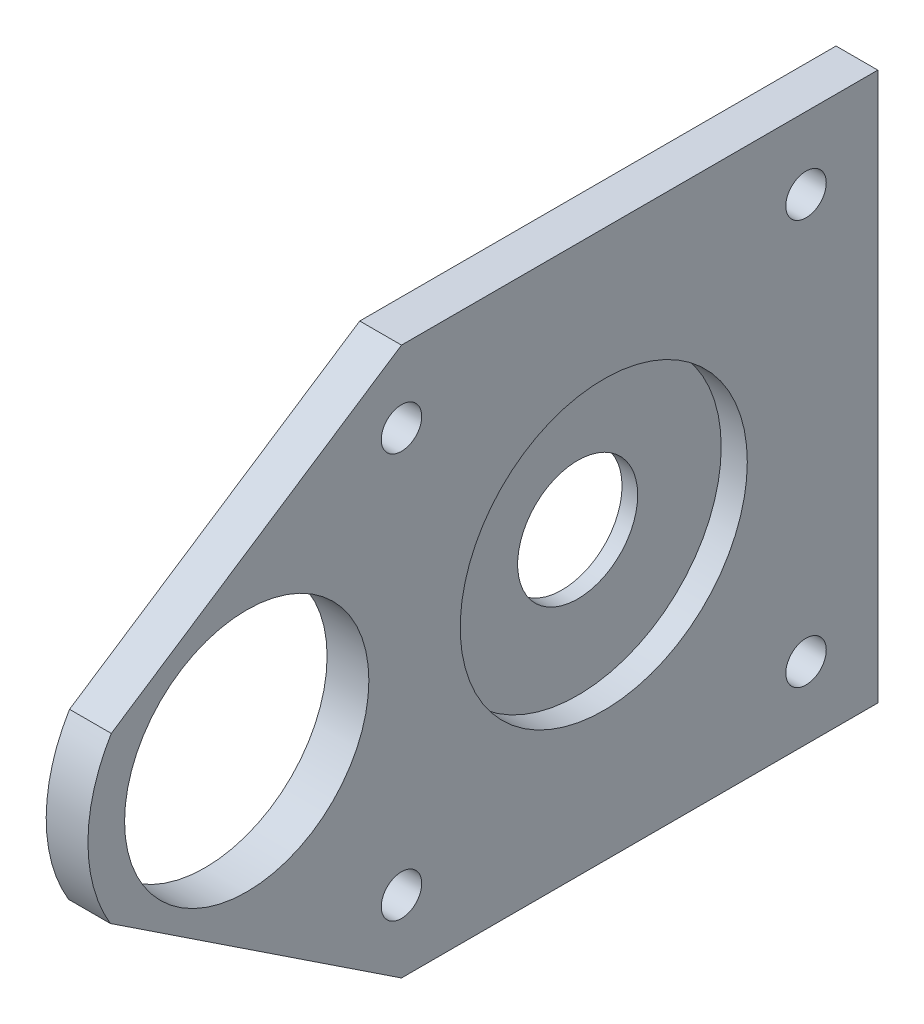
ISO-10303-21;
HEADER;
FILE_DESCRIPTION(('STEP AP214'),'2;1');
FILE_NAME('part.step','',(''),(''),'','','');
FILE_SCHEMA(('AUTOMOTIVE_DESIGN { 1 0 10303 214 1 1 1 1 }'));
ENDSEC;
DATA;
#1=APPLICATION_CONTEXT('core data for automotive mechanical design processes');
#2=APPLICATION_PROTOCOL_DEFINITION('international standard','automotive_design',2000,#1);
#3=PRODUCT_CONTEXT('',#1,'mechanical');
#4=PRODUCT('Part','Part','',(#3));
#5=PRODUCT_RELATED_PRODUCT_CATEGORY('part','',(#4));
#6=PRODUCT_DEFINITION_FORMATION('','',#4);
#7=PRODUCT_DEFINITION_CONTEXT('part definition',#1,'design');
#8=PRODUCT_DEFINITION('design','',#6,#7);
#9=PRODUCT_DEFINITION_SHAPE('','',#8);
#10=(LENGTH_UNIT() NAMED_UNIT(*) SI_UNIT(.MILLI.,.METRE.));
#11=(NAMED_UNIT(*) PLANE_ANGLE_UNIT() SI_UNIT($,.RADIAN.));
#12=(NAMED_UNIT(*) SI_UNIT($,.STERADIAN.) SOLID_ANGLE_UNIT());
#13=UNCERTAINTY_MEASURE_WITH_UNIT(LENGTH_MEASURE(1.E-05),#10,'distance_accuracy_value','');
#14=(GEOMETRIC_REPRESENTATION_CONTEXT(3) GLOBAL_UNCERTAINTY_ASSIGNED_CONTEXT((#13)) GLOBAL_UNIT_ASSIGNED_CONTEXT((#10,
#11,#12)) REPRESENTATION_CONTEXT('',''));
#15=CARTESIAN_POINT('',(0.,0.,0.));
#16=DIRECTION('',(0.,0.,1.));
#17=DIRECTION('',(1.,0.,0.));
#18=AXIS2_PLACEMENT_3D('',#15,#16,#17);
#19=CARTESIAN_POINT('',(-1.6,0.,21.));
#20=DIRECTION('',(1.,0.,0.));
#21=DIRECTION('',(0.,0.,-1.));
#22=AXIS2_PLACEMENT_3D('',#19,#20,#21);
#23=CYLINDRICAL_SURFACE('',#22,4.6);
#24=CARTESIAN_POINT('',(-1.6,0.,21.));
#25=DIRECTION('',(1.,0.,0.));
#26=DIRECTION('',(0.,0.,-1.));
#27=AXIS2_PLACEMENT_3D('',#24,#25,#26);
#28=CIRCLE('',#27,4.6);
#29=CARTESIAN_POINT('',(-1.6,0.,16.4));
#30=VERTEX_POINT('',#29);
#31=EDGE_CURVE('E105',#30,#30,#28,.T.);
#32=ORIENTED_EDGE('',*,*,#31,.F.);
#33=EDGE_LOOP('',(#32));
#34=FACE_BOUND('',#33,.T.);
#35=CARTESIAN_POINT('',(-0.4,0.,21.));
#36=DIRECTION('',(1.,0.,0.));
#37=DIRECTION('',(0.,0.,-1.));
#38=AXIS2_PLACEMENT_3D('',#35,#36,#37);
#39=CIRCLE('',#38,4.6);
#40=CARTESIAN_POINT('',(-0.4,0.,16.4));
#41=VERTEX_POINT('',#40);
#42=EDGE_CURVE('E33',#41,#41,#39,.F.);
#43=ORIENTED_EDGE('',*,*,#42,.F.);
#44=EDGE_LOOP('',(#43));
#45=FACE_BOUND('',#44,.T.);
#46=ADVANCED_FACE('F29',(#34,#45),#23,.F.);
#47=CARTESIAN_POINT('',(-1.6,21.,75.));
#48=DIRECTION('',(1.,0.,0.));
#49=DIRECTION('',(0.,1.,0.));
#50=AXIS2_PLACEMENT_3D('',#47,#48,#49);
#51=PLANE('',#50);
#52=ORIENTED_EDGE('',*,*,#31,.T.);
#53=EDGE_LOOP('',(#52));
#54=FACE_BOUND('',#53,.T.);
#55=CARTESIAN_POINT('',(-1.6,0.,48.36));
#56=DIRECTION('',(1.,0.,0.));
#57=DIRECTION('',(0.,0.,-1.));
#58=AXIS2_PLACEMENT_3D('',#55,#56,#57);
#59=CIRCLE('',#58,9.36);
#60=CARTESIAN_POINT('',(-1.6,0.,39.));
#61=VERTEX_POINT('',#60);
#62=EDGE_CURVE('E147',#61,#61,#59,.T.);
#63=ORIENTED_EDGE('',*,*,#62,.T.);
#64=EDGE_LOOP('',(#63));
#65=FACE_BOUND('',#64,.T.);
#66=CARTESIAN_POINT('',(-1.6,-15.5,36.5));
#67=DIRECTION('',(1.,0.,0.));
#68=DIRECTION('',(0.,0.,-1.));
#69=AXIS2_PLACEMENT_3D('',#66,#67,#68);
#70=CIRCLE('',#69,1.55);
#71=CARTESIAN_POINT('',(-1.6,-15.5,34.95));
#72=VERTEX_POINT('',#71);
#73=EDGE_CURVE('E141',#72,#72,#70,.T.);
#74=ORIENTED_EDGE('',*,*,#73,.T.);
#75=EDGE_LOOP('',(#74));
#76=FACE_BOUND('',#75,.T.);
#77=CARTESIAN_POINT('',(-1.6,15.5,36.5));
#78=DIRECTION('',(1.,0.,0.));
#79=DIRECTION('',(0.,0.,-1.));
#80=AXIS2_PLACEMENT_3D('',#77,#78,#79);
#81=CIRCLE('',#80,1.55);
#82=CARTESIAN_POINT('',(-1.6,15.5,34.95));
#83=VERTEX_POINT('',#82);
#84=EDGE_CURVE('E135',#83,#83,#81,.T.);
#85=ORIENTED_EDGE('',*,*,#84,.T.);
#86=EDGE_LOOP('',(#85));
#87=FACE_BOUND('',#86,.T.);
#88=CARTESIAN_POINT('',(-1.6,-15.5,5.5));
#89=DIRECTION('',(1.,0.,0.));
#90=DIRECTION('',(0.,0.,-1.));
#91=AXIS2_PLACEMENT_3D('',#88,#89,#90);
#92=CIRCLE('',#91,1.55);
#93=CARTESIAN_POINT('',(-1.6,-15.5,3.95));
#94=VERTEX_POINT('',#93);
#95=EDGE_CURVE('E129',#94,#94,#92,.T.);
#96=ORIENTED_EDGE('',*,*,#95,.T.);
#97=EDGE_LOOP('',(#96));
#98=FACE_BOUND('',#97,.T.);
#99=CARTESIAN_POINT('',(-1.6,15.5,5.5));
#100=DIRECTION('',(1.,0.,0.));
#101=DIRECTION('',(0.,0.,-1.));
#102=AXIS2_PLACEMENT_3D('',#99,#100,#101);
#103=CIRCLE('',#102,1.55);
#104=CARTESIAN_POINT('',(-1.6,15.5,3.95));
#105=VERTEX_POINT('',#104);
#106=EDGE_CURVE('E123',#105,#105,#103,.T.);
#107=ORIENTED_EDGE('',*,*,#106,.T.);
#108=EDGE_LOOP('',(#107));
#109=FACE_BOUND('',#108,.T.);
#110=CARTESIAN_POINT('',(-1.6,0.,48.36));
#111=DIRECTION('',(-1.,0.,0.));
#112=DIRECTION('',(0.,0.,-1.));
#113=AXIS2_PLACEMENT_3D('',#110,#111,#112);
#114=CIRCLE('',#113,12.1661417980393);
#115=CARTESIAN_POINT('',(-1.6,-6.22626959128413,58.8122042281354));
#116=VERTEX_POINT('',#115);
#117=CARTESIAN_POINT('',(-1.6,6.35,58.7375));
#118=VERTEX_POINT('',#117);
#119=EDGE_CURVE('E159',#116,#118,#114,.T.);
#120=ORIENTED_EDGE('',*,*,#119,.T.);
#121=DIRECTION('',(0.,0.550142289173026,-0.835070932115028));
#122=VECTOR('',#121,1.);
#123=CARTESIAN_POINT('',(-1.6,21.,36.5));
#124=LINE('',#123,#122);
#125=CARTESIAN_POINT('',(-1.6,21.,36.5));
#126=VERTEX_POINT('',#125);
#127=EDGE_CURVE('E95',#118,#126,#124,.T.);
#128=ORIENTED_EDGE('',*,*,#127,.T.);
#129=DIRECTION('',(0.,0.,-1.));
#130=VECTOR('',#129,1.);
#131=CARTESIAN_POINT('',(-1.6,21.,75.));
#132=LINE('',#131,#130);
#133=CARTESIAN_POINT('',(-1.6,21.,0.));
#134=VERTEX_POINT('',#133);
#135=EDGE_CURVE('E53',#126,#134,#132,.T.);
#136=ORIENTED_EDGE('',*,*,#135,.T.);
#137=DIRECTION('',(0.,-1.,0.));
#138=VECTOR('',#137,1.);
#139=CARTESIAN_POINT('',(-1.6,21.,0.));
#140=LINE('',#139,#138);
#141=CARTESIAN_POINT('',(-1.59999999999999,-21.,0.));
#142=VERTEX_POINT('',#141);
#143=EDGE_CURVE('E121',#134,#142,#140,.T.);
#144=ORIENTED_EDGE('',*,*,#143,.T.);
#145=DIRECTION('',(0.,0.,-1.));
#146=VECTOR('',#145,1.);
#147=CARTESIAN_POINT('',(-1.59999999999999,-21.,75.));
#148=LINE('',#147,#146);
#149=CARTESIAN_POINT('',(-1.6,-21.,36.5));
#150=VERTEX_POINT('',#149);
#151=EDGE_CURVE('E11',#150,#142,#148,.T.);
#152=ORIENTED_EDGE('',*,*,#151,.F.);
#153=DIRECTION('',(0.,0.552082613670704,0.833789414470179));
#154=VECTOR('',#153,1.);
#155=CARTESIAN_POINT('',(-1.6,-6.22626959128413,58.8122042281354));
#156=LINE('',#155,#154);
#157=EDGE_CURVE('E90',#150,#116,#156,.T.);
#158=ORIENTED_EDGE('',*,*,#157,.T.);
#159=EDGE_LOOP('',(#120,#128,#136,#144,#152,#158));
#160=FACE_BOUND('',#159,.T.);
#161=ADVANCED_FACE('F31',(#54,#65,#76,#87,#98,#109,#160),#51,.F.);
#162=CARTESIAN_POINT('',(-1.59999999999999,-21.,75.));
#163=DIRECTION('',(0.,1.,0.));
#164=DIRECTION('',(0.,0.,1.));
#165=AXIS2_PLACEMENT_3D('',#162,#163,#164);
#166=PLANE('',#165);
#167=DIRECTION('',(0.,0.,-1.));
#168=VECTOR('',#167,1.);
#169=CARTESIAN_POINT('',(1.6,-21.,75.));
#170=LINE('',#169,#168);
#171=CARTESIAN_POINT('',(1.6,-21.,36.5));
#172=VERTEX_POINT('',#171);
#173=CARTESIAN_POINT('',(1.6,-21.,0.));
#174=VERTEX_POINT('',#173);
#175=EDGE_CURVE('E38',#172,#174,#170,.T.);
#176=ORIENTED_EDGE('',*,*,#175,.F.);
#177=DIRECTION('',(1.,0.,0.));
#178=VECTOR('',#177,1.);
#179=CARTESIAN_POINT('',(-1.6,-21.,36.5));
#180=LINE('',#179,#178);
#181=EDGE_CURVE('E84',#150,#172,#180,.T.);
#182=ORIENTED_EDGE('',*,*,#181,.F.);
#183=ORIENTED_EDGE('',*,*,#151,.T.);
#184=DIRECTION('',(1.,0.,0.));
#185=VECTOR('',#184,1.);
#186=CARTESIAN_POINT('',(-1.59999999999999,-21.,0.));
#187=LINE('',#186,#185);
#188=EDGE_CURVE('E109',#142,#174,#187,.T.);
#189=ORIENTED_EDGE('',*,*,#188,.T.);
#190=EDGE_LOOP('',(#176,#182,#183,#189));
#191=FACE_BOUND('',#190,.T.);
#192=ADVANCED_FACE('F107',(#191),#166,.F.);
#193=CARTESIAN_POINT('',(1.6,21.,75.));
#194=DIRECTION('',(-1.,0.,0.));
#195=DIRECTION('',(0.,0.,1.));
#196=AXIS2_PLACEMENT_3D('',#193,#194,#195);
#197=PLANE('',#196);
#198=CARTESIAN_POINT('',(1.6,0.,21.));
#199=DIRECTION('',(1.,0.,0.));
#200=DIRECTION('',(0.,0.,-1.));
#201=AXIS2_PLACEMENT_3D('',#198,#199,#200);
#202=CIRCLE('',#201,11.);
#203=CARTESIAN_POINT('',(1.6,0.,10.));
#204=VERTEX_POINT('',#203);
#205=EDGE_CURVE('E170',#204,#204,#202,.T.);
#206=ORIENTED_EDGE('',*,*,#205,.F.);
#207=EDGE_LOOP('',(#206));
#208=FACE_BOUND('',#207,.T.);
#209=DIRECTION('',(0.,0.,-1.));
#210=VECTOR('',#209,1.);
#211=CARTESIAN_POINT('',(1.6,21.,75.));
#212=LINE('',#211,#210);
#213=CARTESIAN_POINT('',(1.6,21.,36.5));
#214=VERTEX_POINT('',#213);
#215=CARTESIAN_POINT('',(1.6,21.,0.));
#216=VERTEX_POINT('',#215);
#217=EDGE_CURVE('E111',#214,#216,#212,.T.);
#218=ORIENTED_EDGE('',*,*,#217,.F.);
#219=DIRECTION('',(0.,0.550142289173026,-0.835070932115028));
#220=VECTOR('',#219,1.);
#221=CARTESIAN_POINT('',(1.6,21.,36.5));
#222=LINE('',#221,#220);
#223=CARTESIAN_POINT('',(1.6,6.35,58.7375));
#224=VERTEX_POINT('',#223);
#225=EDGE_CURVE('E45',#224,#214,#222,.T.);
#226=ORIENTED_EDGE('',*,*,#225,.F.);
#227=CARTESIAN_POINT('',(1.6,0.,48.36));
#228=DIRECTION('',(-1.,0.,0.));
#229=DIRECTION('',(0.,0.,-1.));
#230=AXIS2_PLACEMENT_3D('',#227,#228,#229);
#231=CIRCLE('',#230,12.1661417980393);
#232=CARTESIAN_POINT('',(1.6,-6.22626959128413,58.8122042281354));
#233=VERTEX_POINT('',#232);
#234=EDGE_CURVE('E104',#233,#224,#231,.T.);
#235=ORIENTED_EDGE('',*,*,#234,.F.);
#236=DIRECTION('',(0.,0.552082613670704,0.833789414470179));
#237=VECTOR('',#236,1.);
#238=CARTESIAN_POINT('',(1.6,-6.22626959128413,58.8122042281354));
#239=LINE('',#238,#237);
#240=EDGE_CURVE('E87',#172,#233,#239,.T.);
#241=ORIENTED_EDGE('',*,*,#240,.F.);
#242=ORIENTED_EDGE('',*,*,#175,.T.);
#243=DIRECTION('',(0.,1.,0.));
#244=VECTOR('',#243,1.);
#245=CARTESIAN_POINT('',(1.6,21.,0.));
#246=LINE('',#245,#244);
#247=EDGE_CURVE('E118',#174,#216,#246,.T.);
#248=ORIENTED_EDGE('',*,*,#247,.T.);
#249=EDGE_LOOP('',(#218,#226,#235,#241,#242,#248));
#250=FACE_BOUND('',#249,.T.);
#251=CARTESIAN_POINT('',(1.6,0.,48.36));
#252=DIRECTION('',(1.,0.,0.));
#253=DIRECTION('',(0.,0.,-1.));
#254=AXIS2_PLACEMENT_3D('',#251,#252,#253);
#255=CIRCLE('',#254,9.36);
#256=CARTESIAN_POINT('',(1.6,0.,39.));
#257=VERTEX_POINT('',#256);
#258=EDGE_CURVE('E150',#257,#257,#255,.T.);
#259=ORIENTED_EDGE('',*,*,#258,.F.);
#260=EDGE_LOOP('',(#259));
#261=FACE_BOUND('',#260,.T.);
#262=CARTESIAN_POINT('',(1.6,-15.5,36.5));
#263=DIRECTION('',(1.,0.,0.));
#264=DIRECTION('',(0.,0.,-1.));
#265=AXIS2_PLACEMENT_3D('',#262,#263,#264);
#266=CIRCLE('',#265,1.55);
#267=CARTESIAN_POINT('',(1.6,-15.5,34.95));
#268=VERTEX_POINT('',#267);
#269=EDGE_CURVE('E144',#268,#268,#266,.T.);
#270=ORIENTED_EDGE('',*,*,#269,.F.);
#271=EDGE_LOOP('',(#270));
#272=FACE_BOUND('',#271,.T.);
#273=CARTESIAN_POINT('',(1.6,15.5,36.5));
#274=DIRECTION('',(1.,0.,0.));
#275=DIRECTION('',(0.,0.,-1.));
#276=AXIS2_PLACEMENT_3D('',#273,#274,#275);
#277=CIRCLE('',#276,1.55);
#278=CARTESIAN_POINT('',(1.6,15.5,34.95));
#279=VERTEX_POINT('',#278);
#280=EDGE_CURVE('E138',#279,#279,#277,.T.);
#281=ORIENTED_EDGE('',*,*,#280,.F.);
#282=EDGE_LOOP('',(#281));
#283=FACE_BOUND('',#282,.T.);
#284=CARTESIAN_POINT('',(1.6,-15.5,5.5));
#285=DIRECTION('',(1.,0.,0.));
#286=DIRECTION('',(0.,0.,-1.));
#287=AXIS2_PLACEMENT_3D('',#284,#285,#286);
#288=CIRCLE('',#287,1.55);
#289=CARTESIAN_POINT('',(1.6,-15.5,3.95));
#290=VERTEX_POINT('',#289);
#291=EDGE_CURVE('E132',#290,#290,#288,.T.);
#292=ORIENTED_EDGE('',*,*,#291,.F.);
#293=EDGE_LOOP('',(#292));
#294=FACE_BOUND('',#293,.T.);
#295=CARTESIAN_POINT('',(1.6,15.5,5.5));
#296=DIRECTION('',(1.,0.,0.));
#297=DIRECTION('',(0.,0.,-1.));
#298=AXIS2_PLACEMENT_3D('',#295,#296,#297);
#299=CIRCLE('',#298,1.55);
#300=CARTESIAN_POINT('',(1.6,15.5,3.95));
#301=VERTEX_POINT('',#300);
#302=EDGE_CURVE('E126',#301,#301,#299,.T.);
#303=ORIENTED_EDGE('',*,*,#302,.F.);
#304=EDGE_LOOP('',(#303));
#305=FACE_BOUND('',#304,.T.);
#306=ADVANCED_FACE('F99',(#208,#250,#261,#272,#283,#294,#305),#197,.F.);
#307=CARTESIAN_POINT('',(-1.6,21.,75.));
#308=DIRECTION('',(0.,-1.,0.));
#309=DIRECTION('',(0.,0.,-1.));
#310=AXIS2_PLACEMENT_3D('',#307,#308,#309);
#311=PLANE('',#310);
#312=ORIENTED_EDGE('',*,*,#135,.F.);
#313=DIRECTION('',(1.,0.,0.));
#314=VECTOR('',#313,1.);
#315=CARTESIAN_POINT('',(-1.6,21.,36.5));
#316=LINE('',#315,#314);
#317=EDGE_CURVE('E152',#126,#214,#316,.T.);
#318=ORIENTED_EDGE('',*,*,#317,.T.);
#319=ORIENTED_EDGE('',*,*,#217,.T.);
#320=DIRECTION('',(-1.,0.,0.));
#321=VECTOR('',#320,1.);
#322=CARTESIAN_POINT('',(-1.6,21.,0.));
#323=LINE('',#322,#321);
#324=EDGE_CURVE('E116',#216,#134,#323,.T.);
#325=ORIENTED_EDGE('',*,*,#324,.T.);
#326=EDGE_LOOP('',(#312,#318,#319,#325));
#327=FACE_BOUND('',#326,.T.);
#328=ADVANCED_FACE('F177',(#327),#311,.F.);
#329=CARTESIAN_POINT('',(-1.59999999999999,-21.,0.));
#330=DIRECTION('',(0.,0.,1.));
#331=DIRECTION('',(1.,0.,0.));
#332=AXIS2_PLACEMENT_3D('',#329,#330,#331);
#333=PLANE('',#332);
#334=ORIENTED_EDGE('',*,*,#143,.F.);
#335=ORIENTED_EDGE('',*,*,#324,.F.);
#336=ORIENTED_EDGE('',*,*,#247,.F.);
#337=ORIENTED_EDGE('',*,*,#188,.F.);
#338=EDGE_LOOP('',(#334,#335,#336,#337));
#339=FACE_BOUND('',#338,.T.);
#340=ADVANCED_FACE('F183',(#339),#333,.F.);
#341=CARTESIAN_POINT('',(-1.6,15.5,5.5));
#342=DIRECTION('',(1.,0.,0.));
#343=DIRECTION('',(0.,0.,-1.));
#344=AXIS2_PLACEMENT_3D('',#341,#342,#343);
#345=CYLINDRICAL_SURFACE('',#344,1.55);
#346=ORIENTED_EDGE('',*,*,#106,.F.);
#347=EDGE_LOOP('',(#346));
#348=FACE_BOUND('',#347,.T.);
#349=ORIENTED_EDGE('',*,*,#302,.T.);
#350=EDGE_LOOP('',(#349));
#351=FACE_BOUND('',#350,.T.);
#352=ADVANCED_FACE('F223',(#348,#351),#345,.F.);
#353=CARTESIAN_POINT('',(-1.6,-15.5,5.5));
#354=DIRECTION('',(1.,0.,0.));
#355=DIRECTION('',(0.,0.,-1.));
#356=AXIS2_PLACEMENT_3D('',#353,#354,#355);
#357=CYLINDRICAL_SURFACE('',#356,1.55);
#358=ORIENTED_EDGE('',*,*,#95,.F.);
#359=EDGE_LOOP('',(#358));
#360=FACE_BOUND('',#359,.T.);
#361=ORIENTED_EDGE('',*,*,#291,.T.);
#362=EDGE_LOOP('',(#361));
#363=FACE_BOUND('',#362,.T.);
#364=ADVANCED_FACE('F219',(#360,#363),#357,.F.);
#365=CARTESIAN_POINT('',(-1.6,15.5,36.5));
#366=DIRECTION('',(1.,0.,0.));
#367=DIRECTION('',(0.,0.,-1.));
#368=AXIS2_PLACEMENT_3D('',#365,#366,#367);
#369=CYLINDRICAL_SURFACE('',#368,1.55);
#370=ORIENTED_EDGE('',*,*,#84,.F.);
#371=EDGE_LOOP('',(#370));
#372=FACE_BOUND('',#371,.T.);
#373=ORIENTED_EDGE('',*,*,#280,.T.);
#374=EDGE_LOOP('',(#373));
#375=FACE_BOUND('',#374,.T.);
#376=ADVANCED_FACE('F215',(#372,#375),#369,.F.);
#377=CARTESIAN_POINT('',(-1.6,-15.5,36.5));
#378=DIRECTION('',(1.,0.,0.));
#379=DIRECTION('',(0.,0.,-1.));
#380=AXIS2_PLACEMENT_3D('',#377,#378,#379);
#381=CYLINDRICAL_SURFACE('',#380,1.55);
#382=ORIENTED_EDGE('',*,*,#73,.F.);
#383=EDGE_LOOP('',(#382));
#384=FACE_BOUND('',#383,.T.);
#385=ORIENTED_EDGE('',*,*,#269,.T.);
#386=EDGE_LOOP('',(#385));
#387=FACE_BOUND('',#386,.T.);
#388=ADVANCED_FACE('F211',(#384,#387),#381,.F.);
#389=CARTESIAN_POINT('',(-1.6,0.,48.36));
#390=DIRECTION('',(1.,0.,0.));
#391=DIRECTION('',(0.,0.,-1.));
#392=AXIS2_PLACEMENT_3D('',#389,#390,#391);
#393=CYLINDRICAL_SURFACE('',#392,9.36);
#394=ORIENTED_EDGE('',*,*,#62,.F.);
#395=EDGE_LOOP('',(#394));
#396=FACE_BOUND('',#395,.T.);
#397=ORIENTED_EDGE('',*,*,#258,.T.);
#398=EDGE_LOOP('',(#397));
#399=FACE_BOUND('',#398,.T.);
#400=ADVANCED_FACE('F202',(#396,#399),#393,.F.);
#401=CARTESIAN_POINT('',(-1.6,21.,36.5));
#402=DIRECTION('',(0.,-0.835070932115028,-0.550142289173026));
#403=DIRECTION('',(0.,0.550142289173026,-0.835070932115028));
#404=AXIS2_PLACEMENT_3D('',#401,#402,#403);
#405=PLANE('',#404);
#406=ORIENTED_EDGE('',*,*,#317,.F.);
#407=ORIENTED_EDGE('',*,*,#127,.F.);
#408=DIRECTION('',(1.,0.,0.));
#409=VECTOR('',#408,1.);
#410=CARTESIAN_POINT('',(-1.6,6.35,58.7375));
#411=LINE('',#410,#409);
#412=EDGE_CURVE('E155',#118,#224,#411,.T.);
#413=ORIENTED_EDGE('',*,*,#412,.T.);
#414=ORIENTED_EDGE('',*,*,#225,.T.);
#415=EDGE_LOOP('',(#406,#407,#413,#414));
#416=FACE_BOUND('',#415,.T.);
#417=ADVANCED_FACE('F198',(#416),#405,.F.);
#418=CARTESIAN_POINT('',(-1.6,0.,48.36));
#419=DIRECTION('',(1.,0.,0.));
#420=DIRECTION('',(0.,0.,-1.));
#421=AXIS2_PLACEMENT_3D('',#418,#419,#420);
#422=CYLINDRICAL_SURFACE('',#421,12.1661417980393);
#423=ORIENTED_EDGE('',*,*,#412,.F.);
#424=ORIENTED_EDGE('',*,*,#119,.F.);
#425=DIRECTION('',(1.,0.,0.));
#426=VECTOR('',#425,1.);
#427=CARTESIAN_POINT('',(-1.6,-6.22626959128413,58.8122042281354));
#428=LINE('',#427,#426);
#429=EDGE_CURVE('E94',#116,#233,#428,.T.);
#430=ORIENTED_EDGE('',*,*,#429,.T.);
#431=ORIENTED_EDGE('',*,*,#234,.T.);
#432=EDGE_LOOP('',(#423,#424,#430,#431));
#433=FACE_BOUND('',#432,.T.);
#434=ADVANCED_FACE('F201',(#433),#422,.T.);
#435=CARTESIAN_POINT('',(-1.6,-6.22626959128413,58.8122042281354));
#436=DIRECTION('',(0.,0.833789414470179,-0.552082613670704));
#437=DIRECTION('',(0.,0.552082613670704,0.83378941447018));
#438=AXIS2_PLACEMENT_3D('',#435,#436,#437);
#439=PLANE('',#438);
#440=ORIENTED_EDGE('',*,*,#429,.F.);
#441=ORIENTED_EDGE('',*,*,#157,.F.);
#442=ORIENTED_EDGE('',*,*,#181,.T.);
#443=ORIENTED_EDGE('',*,*,#240,.T.);
#444=EDGE_LOOP('',(#440,#441,#442,#443));
#445=FACE_BOUND('',#444,.T.);
#446=ADVANCED_FACE('F86',(#445),#439,.F.);
#447=CARTESIAN_POINT('',(-0.4,0.,21.));
#448=DIRECTION('',(1.,0.,0.));
#449=DIRECTION('',(0.,0.,-1.));
#450=AXIS2_PLACEMENT_3D('',#447,#448,#449);
#451=PLANE('',#450);
#452=CARTESIAN_POINT('',(-0.4,0.,21.));
#453=DIRECTION('',(1.,0.,0.));
#454=DIRECTION('',(0.,0.,-1.));
#455=AXIS2_PLACEMENT_3D('',#452,#453,#454);
#456=CIRCLE('',#455,11.);
#457=CARTESIAN_POINT('',(-0.4,0.,10.));
#458=VERTEX_POINT('',#457);
#459=EDGE_CURVE('E167',#458,#458,#456,.T.);
#460=ORIENTED_EDGE('',*,*,#459,.T.);
#461=EDGE_LOOP('',(#460));
#462=FACE_BOUND('',#461,.T.);
#463=ORIENTED_EDGE('',*,*,#42,.T.);
#464=EDGE_LOOP('',(#463));
#465=FACE_BOUND('',#464,.T.);
#466=ADVANCED_FACE('F208',(#462,#465),#451,.T.);
#467=CARTESIAN_POINT('',(-0.4,0.,21.));
#468=DIRECTION('',(1.,0.,0.));
#469=DIRECTION('',(0.,0.,-1.));
#470=AXIS2_PLACEMENT_3D('',#467,#468,#469);
#471=CYLINDRICAL_SURFACE('',#470,11.);
#472=ORIENTED_EDGE('',*,*,#459,.F.);
#473=EDGE_LOOP('',(#472));
#474=FACE_BOUND('',#473,.T.);
#475=ORIENTED_EDGE('',*,*,#205,.T.);
#476=EDGE_LOOP('',(#475));
#477=FACE_BOUND('',#476,.T.);
#478=ADVANCED_FACE('F174',(#474,#477),#471,.F.);
#479=CLOSED_SHELL('',(#46,#161,#192,#306,#328,#340,#352,#364,#376,#388,#400,#417,#434,#446,#466,#478));
#480=MANIFOLD_SOLID_BREP('B2',#479);
#481=ADVANCED_BREP_SHAPE_REPRESENTATION('',(#18,#480),#14);
#482=SHAPE_DEFINITION_REPRESENTATION(#9,#481);
ENDSEC;
END-ISO-10303-21;
